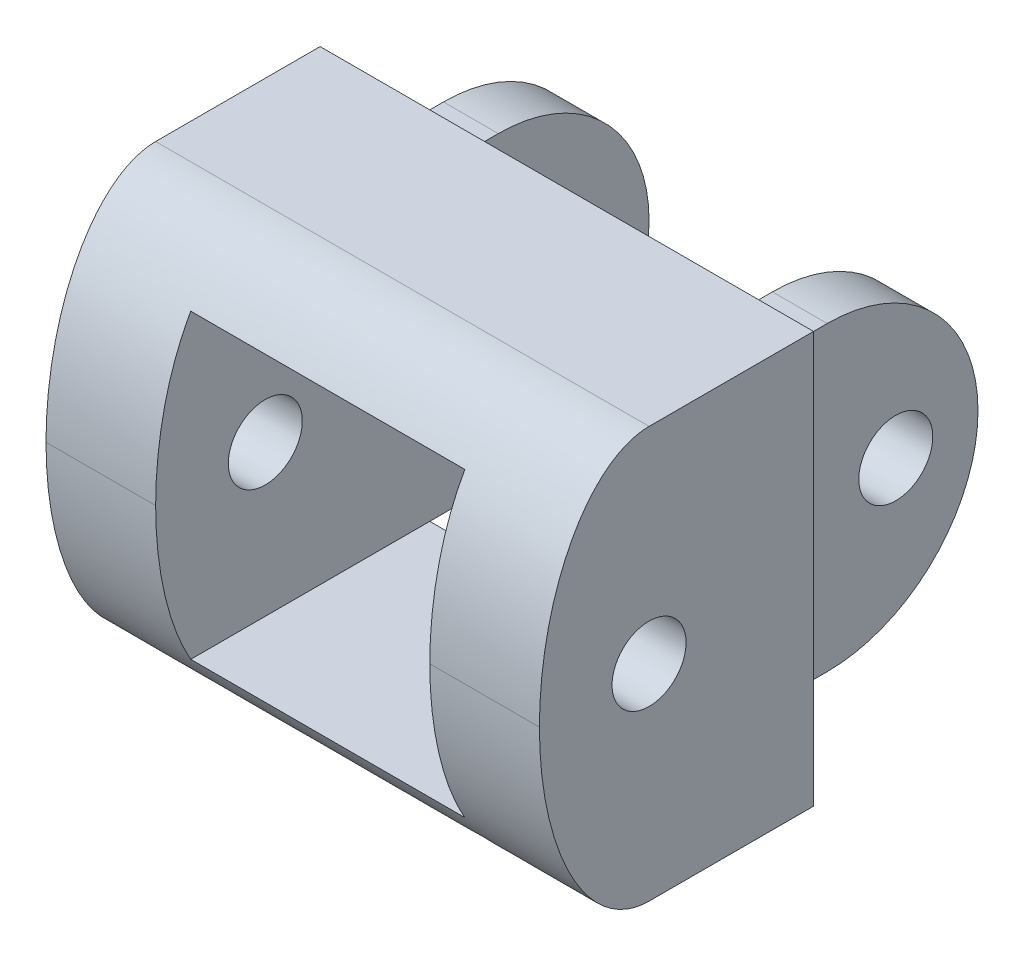
ISO-10303-21;
HEADER;
FILE_DESCRIPTION(('STEP AP214'),'2;1');
FILE_NAME('part.step','',(''),(''),'','','');
FILE_SCHEMA(('AUTOMOTIVE_DESIGN { 1 0 10303 214 1 1 1 1 }'));
ENDSEC;
DATA;
#1=APPLICATION_CONTEXT('core data for automotive mechanical design processes');
#2=APPLICATION_PROTOCOL_DEFINITION('international standard','automotive_design',2000,#1);
#3=PRODUCT_CONTEXT('',#1,'mechanical');
#4=PRODUCT('Part','Part','',(#3));
#5=PRODUCT_RELATED_PRODUCT_CATEGORY('part','',(#4));
#6=PRODUCT_DEFINITION_FORMATION('','',#4);
#7=PRODUCT_DEFINITION_CONTEXT('part definition',#1,'design');
#8=PRODUCT_DEFINITION('design','',#6,#7);
#9=PRODUCT_DEFINITION_SHAPE('','',#8);
#10=(LENGTH_UNIT() NAMED_UNIT(*) SI_UNIT(.MILLI.,.METRE.));
#11=(NAMED_UNIT(*) PLANE_ANGLE_UNIT() SI_UNIT($,.RADIAN.));
#12=(NAMED_UNIT(*) SI_UNIT($,.STERADIAN.) SOLID_ANGLE_UNIT());
#13=UNCERTAINTY_MEASURE_WITH_UNIT(LENGTH_MEASURE(1.E-05),#10,'distance_accuracy_value','');
#14=(GEOMETRIC_REPRESENTATION_CONTEXT(3) GLOBAL_UNCERTAINTY_ASSIGNED_CONTEXT((#13)) GLOBAL_UNIT_ASSIGNED_CONTEXT((#10,
#11,#12)) REPRESENTATION_CONTEXT('',''));
#15=CARTESIAN_POINT('',(0.,0.,0.));
#16=DIRECTION('',(0.,0.,1.));
#17=DIRECTION('',(1.,0.,0.));
#18=AXIS2_PLACEMENT_3D('',#15,#16,#17);
#19=CARTESIAN_POINT('',(16.,2.,-18.));
#20=DIRECTION('',(0.,1.,0.));
#21=DIRECTION('',(0.,0.,1.));
#22=AXIS2_PLACEMENT_3D('',#19,#20,#21);
#23=PLANE('',#22);
#24=DIRECTION('',(0.,0.,1.));
#25=VECTOR('',#24,1.);
#26=CARTESIAN_POINT('',(14.,2.,-10.));
#27=LINE('',#26,#25);
#28=CARTESIAN_POINT('',(14.,2.,-12.5));
#29=VERTEX_POINT('',#28);
#30=CARTESIAN_POINT('',(14.,2.,-10.));
#31=VERTEX_POINT('',#30);
#32=EDGE_CURVE('E226',#29,#31,#27,.T.);
#33=ORIENTED_EDGE('',*,*,#32,.F.);
#34=DIRECTION('',(-1.,0.,0.));
#35=VECTOR('',#34,1.);
#36=CARTESIAN_POINT('',(16.,2.,-12.5));
#37=LINE('',#36,#35);
#38=CARTESIAN_POINT('',(16.,2.,-12.5));
#39=VERTEX_POINT('',#38);
#40=EDGE_CURVE('E402',#29,#39,#37,.F.);
#41=ORIENTED_EDGE('',*,*,#40,.T.);
#42=DIRECTION('',(0.,0.,1.));
#43=VECTOR('',#42,1.);
#44=CARTESIAN_POINT('',(16.,2.,-18.));
#45=LINE('',#44,#43);
#46=CARTESIAN_POINT('',(16.,2.,-10.));
#47=VERTEX_POINT('',#46);
#48=EDGE_CURVE('E603',#39,#47,#45,.T.);
#49=ORIENTED_EDGE('',*,*,#48,.T.);
#50=DIRECTION('',(-1.,0.,0.));
#51=VECTOR('',#50,1.);
#52=CARTESIAN_POINT('',(16.,2.,-10.));
#53=LINE('',#52,#51);
#54=EDGE_CURVE('E405',#47,#31,#53,.T.);
#55=ORIENTED_EDGE('',*,*,#54,.T.);
#56=EDGE_LOOP('',(#33,#41,#49,#55));
#57=FACE_BOUND('',#56,.T.);
#58=ADVANCED_FACE('F37',(#57),#23,.F.);
#59=CARTESIAN_POINT('',(16.,13.,-18.));
#60=DIRECTION('',(0.,-1.,0.));
#61=DIRECTION('',(0.,0.,-1.));
#62=AXIS2_PLACEMENT_3D('',#59,#60,#61);
#63=PLANE('',#62);
#64=DIRECTION('',(0.,0.,1.));
#65=VECTOR('',#64,1.);
#66=CARTESIAN_POINT('',(4.,13.,-10.));
#67=LINE('',#66,#65);
#68=CARTESIAN_POINT('',(4.,13.,-12.5));
#69=VERTEX_POINT('',#68);
#70=CARTESIAN_POINT('',(4.,13.,-10.));
#71=VERTEX_POINT('',#70);
#72=EDGE_CURVE('E188',#69,#71,#67,.T.);
#73=ORIENTED_EDGE('',*,*,#72,.F.);
#74=DIRECTION('',(1.,0.,0.));
#75=VECTOR('',#74,1.);
#76=CARTESIAN_POINT('',(2.,13.,-12.5));
#77=LINE('',#76,#75);
#78=CARTESIAN_POINT('',(2.,13.,-12.5));
#79=VERTEX_POINT('',#78);
#80=EDGE_CURVE('E187',#69,#79,#77,.F.);
#81=ORIENTED_EDGE('',*,*,#80,.T.);
#82=DIRECTION('',(0.,0.,1.));
#83=VECTOR('',#82,1.);
#84=CARTESIAN_POINT('',(2.,13.,-18.));
#85=LINE('',#84,#83);
#86=CARTESIAN_POINT('',(2.,13.,-10.));
#87=VERTEX_POINT('',#86);
#88=EDGE_CURVE('E599',#79,#87,#85,.T.);
#89=ORIENTED_EDGE('',*,*,#88,.T.);
#90=DIRECTION('',(1.,0.,0.));
#91=VECTOR('',#90,1.);
#92=CARTESIAN_POINT('',(16.,13.,-10.));
#93=LINE('',#92,#91);
#94=EDGE_CURVE('E593',#87,#71,#93,.T.);
#95=ORIENTED_EDGE('',*,*,#94,.T.);
#96=EDGE_LOOP('',(#73,#81,#89,#95));
#97=FACE_BOUND('',#96,.T.);
#98=ADVANCED_FACE('F385',(#97),#63,.F.);
#99=CARTESIAN_POINT('',(0.,7.5,-12.5));
#100=DIRECTION('',(-1.,0.,0.));
#101=DIRECTION('',(0.,0.,1.));
#102=AXIS2_PLACEMENT_3D('',#99,#100,#101);
#103=CYLINDRICAL_SURFACE('',#102,5.5);
#104=DIRECTION('',(1.,0.,0.));
#105=VECTOR('',#104,1.);
#106=CARTESIAN_POINT('',(16.,7.5,-18.));
#107=LINE('',#106,#105);
#108=CARTESIAN_POINT('',(14.,7.5,-18.));
#109=VERTEX_POINT('',#108);
#110=CARTESIAN_POINT('',(16.,7.5,-18.));
#111=VERTEX_POINT('',#110);
#112=EDGE_CURVE('E193',#109,#111,#107,.T.);
#113=ORIENTED_EDGE('',*,*,#112,.F.);
#114=CARTESIAN_POINT('',(14.,7.5,-12.5));
#115=DIRECTION('',(-1.,0.,0.));
#116=DIRECTION('',(0.,0.,1.));
#117=AXIS2_PLACEMENT_3D('',#114,#115,#116);
#118=CIRCLE('',#117,5.5);
#119=CARTESIAN_POINT('',(14.,13.,-12.5));
#120=VERTEX_POINT('',#119);
#121=EDGE_CURVE('E178',#109,#120,#118,.F.);
#122=ORIENTED_EDGE('',*,*,#121,.T.);
#123=CARTESIAN_POINT('',(16.,13.,-12.5));
#124=VERTEX_POINT('',#123);
#125=EDGE_CURVE('E201',#124,#120,#77,.F.);
#126=ORIENTED_EDGE('',*,*,#125,.F.);
#127=CARTESIAN_POINT('',(16.,7.5,-12.5));
#128=DIRECTION('',(-1.,0.,0.));
#129=DIRECTION('',(0.,0.,1.));
#130=AXIS2_PLACEMENT_3D('',#127,#128,#129);
#131=CIRCLE('',#130,5.5);
#132=EDGE_CURVE('E416',#111,#124,#131,.F.);
#133=ORIENTED_EDGE('',*,*,#132,.F.);
#134=EDGE_LOOP('',(#113,#122,#126,#133));
#135=FACE_BOUND('',#134,.T.);
#136=ADVANCED_FACE('F392',(#135),#103,.T.);
#137=ORIENTED_EDGE('',*,*,#80,.F.);
#138=CARTESIAN_POINT('',(4.,7.5,-12.5));
#139=DIRECTION('',(1.,0.,0.));
#140=DIRECTION('',(0.,1.,0.));
#141=AXIS2_PLACEMENT_3D('',#138,#139,#140);
#142=CIRCLE('',#141,5.5);
#143=CARTESIAN_POINT('',(4.,7.5,-18.));
#144=VERTEX_POINT('',#143);
#145=EDGE_CURVE('E169',#69,#144,#142,.F.);
#146=ORIENTED_EDGE('',*,*,#145,.T.);
#147=CARTESIAN_POINT('',(2.,7.5,-18.));
#148=VERTEX_POINT('',#147);
#149=EDGE_CURVE('E185',#148,#144,#107,.T.);
#150=ORIENTED_EDGE('',*,*,#149,.F.);
#151=CARTESIAN_POINT('',(2.,7.5,-12.5));
#152=DIRECTION('',(1.,0.,0.));
#153=DIRECTION('',(0.,1.,0.));
#154=AXIS2_PLACEMENT_3D('',#151,#152,#153);
#155=CIRCLE('',#154,5.5);
#156=EDGE_CURVE('E285',#79,#148,#155,.F.);
#157=ORIENTED_EDGE('',*,*,#156,.F.);
#158=EDGE_LOOP('',(#137,#146,#150,#157));
#159=FACE_BOUND('',#158,.T.);
#160=ADVANCED_FACE('F183',(#159),#103,.T.);
#161=CARTESIAN_POINT('',(0.,7.5,-12.5));
#162=DIRECTION('',(1.,0.,0.));
#163=DIRECTION('',(0.,0.,-1.));
#164=AXIS2_PLACEMENT_3D('',#161,#162,#163);
#165=CYLINDRICAL_SURFACE('',#164,5.5);
#166=ORIENTED_EDGE('',*,*,#40,.F.);
#167=CARTESIAN_POINT('',(14.,7.5,-12.5));
#168=DIRECTION('',(-1.,0.,0.));
#169=DIRECTION('',(0.,0.,1.));
#170=AXIS2_PLACEMENT_3D('',#167,#168,#169);
#171=CIRCLE('',#170,5.5);
#172=EDGE_CURVE('E198',#29,#109,#171,.F.);
#173=ORIENTED_EDGE('',*,*,#172,.T.);
#174=ORIENTED_EDGE('',*,*,#112,.T.);
#175=CARTESIAN_POINT('',(16.,7.5,-12.5));
#176=DIRECTION('',(-1.,0.,0.));
#177=DIRECTION('',(0.,0.,1.));
#178=AXIS2_PLACEMENT_3D('',#175,#176,#177);
#179=CIRCLE('',#178,5.5);
#180=EDGE_CURVE('E412',#39,#111,#179,.F.);
#181=ORIENTED_EDGE('',*,*,#180,.F.);
#182=EDGE_LOOP('',(#166,#173,#174,#181));
#183=FACE_BOUND('',#182,.T.);
#184=ADVANCED_FACE('F325',(#183),#165,.T.);
#185=ORIENTED_EDGE('',*,*,#149,.T.);
#186=CARTESIAN_POINT('',(4.,7.5,-12.5));
#187=DIRECTION('',(1.,0.,0.));
#188=DIRECTION('',(0.,1.,0.));
#189=AXIS2_PLACEMENT_3D('',#186,#187,#188);
#190=CIRCLE('',#189,5.5);
#191=CARTESIAN_POINT('',(4.,2.,-12.5));
#192=VERTEX_POINT('',#191);
#193=EDGE_CURVE('E165',#144,#192,#190,.F.);
#194=ORIENTED_EDGE('',*,*,#193,.T.);
#195=CARTESIAN_POINT('',(2.,2.,-12.5));
#196=VERTEX_POINT('',#195);
#197=EDGE_CURVE('E414',#196,#192,#37,.F.);
#198=ORIENTED_EDGE('',*,*,#197,.F.);
#199=CARTESIAN_POINT('',(2.,7.5,-12.5));
#200=DIRECTION('',(1.,0.,0.));
#201=DIRECTION('',(0.,1.,0.));
#202=AXIS2_PLACEMENT_3D('',#199,#200,#201);
#203=CIRCLE('',#202,5.5);
#204=EDGE_CURVE('E191',#148,#196,#203,.F.);
#205=ORIENTED_EDGE('',*,*,#204,.F.);
#206=EDGE_LOOP('',(#185,#194,#198,#205));
#207=FACE_BOUND('',#206,.T.);
#208=ADVANCED_FACE('F190',(#207),#165,.T.);
#209=CARTESIAN_POINT('',(0.,0.,-10.));
#210=DIRECTION('',(0.,0.,-1.));
#211=DIRECTION('',(-1.,0.,0.));
#212=AXIS2_PLACEMENT_3D('',#209,#210,#211);
#213=PLANE('',#212);
#214=DIRECTION('',(0.,-1.,0.));
#215=VECTOR('',#214,1.);
#216=CARTESIAN_POINT('',(0.,0.,-10.));
#217=LINE('',#216,#215);
#218=CARTESIAN_POINT('',(0.,15.,-10.));
#219=VERTEX_POINT('',#218);
#220=CARTESIAN_POINT('',(0.,0.,-10.));
#221=VERTEX_POINT('',#220);
#222=EDGE_CURVE('E605',#219,#221,#217,.T.);
#223=ORIENTED_EDGE('',*,*,#222,.F.);
#224=DIRECTION('',(-1.,0.,0.));
#225=VECTOR('',#224,1.);
#226=CARTESIAN_POINT('',(0.,15.,-10.));
#227=LINE('',#226,#225);
#228=CARTESIAN_POINT('',(18.,15.,-10.));
#229=VERTEX_POINT('',#228);
#230=EDGE_CURVE('E290',#229,#219,#227,.T.);
#231=ORIENTED_EDGE('',*,*,#230,.F.);
#232=DIRECTION('',(0.,1.,0.));
#233=VECTOR('',#232,1.);
#234=CARTESIAN_POINT('',(18.,0.,-10.));
#235=LINE('',#234,#233);
#236=CARTESIAN_POINT('',(18.,0.,-10.));
#237=VERTEX_POINT('',#236);
#238=EDGE_CURVE('E609',#237,#229,#235,.T.);
#239=ORIENTED_EDGE('',*,*,#238,.F.);
#240=DIRECTION('',(1.,0.,0.));
#241=VECTOR('',#240,1.);
#242=CARTESIAN_POINT('',(0.,0.,-10.));
#243=LINE('',#242,#241);
#244=EDGE_CURVE('E446',#221,#237,#243,.T.);
#245=ORIENTED_EDGE('',*,*,#244,.F.);
#246=EDGE_LOOP('',(#223,#231,#239,#245));
#247=FACE_BOUND('',#246,.T.);
#248=ORIENTED_EDGE('',*,*,#54,.F.);
#249=DIRECTION('',(0.,-1.,0.));
#250=VECTOR('',#249,1.);
#251=CARTESIAN_POINT('',(16.,13.,-10.));
#252=LINE('',#251,#250);
#253=CARTESIAN_POINT('',(16.,13.,-10.));
#254=VERTEX_POINT('',#253);
#255=EDGE_CURVE('E192',#254,#47,#252,.T.);
#256=ORIENTED_EDGE('',*,*,#255,.F.);
#257=CARTESIAN_POINT('',(14.,13.,-10.));
#258=VERTEX_POINT('',#257);
#259=EDGE_CURVE('E590',#258,#254,#93,.T.);
#260=ORIENTED_EDGE('',*,*,#259,.F.);
#261=EDGE_CURVE('E591',#71,#258,#93,.T.);
#262=ORIENTED_EDGE('',*,*,#261,.F.);
#263=ORIENTED_EDGE('',*,*,#94,.F.);
#264=DIRECTION('',(0.,1.,0.));
#265=VECTOR('',#264,1.);
#266=CARTESIAN_POINT('',(2.,13.,-10.));
#267=LINE('',#266,#265);
#268=CARTESIAN_POINT('',(2.,2.,-10.));
#269=VERTEX_POINT('',#268);
#270=EDGE_CURVE('E588',#269,#87,#267,.T.);
#271=ORIENTED_EDGE('',*,*,#270,.F.);
#272=CARTESIAN_POINT('',(4.,2.,-10.));
#273=VERTEX_POINT('',#272);
#274=EDGE_CURVE('E196',#273,#269,#53,.T.);
#275=ORIENTED_EDGE('',*,*,#274,.F.);
#276=EDGE_CURVE('E579',#31,#273,#53,.T.);
#277=ORIENTED_EDGE('',*,*,#276,.F.);
#278=EDGE_LOOP('',(#248,#256,#260,#262,#263,#271,#275,#277));
#279=FACE_BOUND('',#278,.T.);
#280=ADVANCED_FACE('F323',(#247,#279),#213,.T.);
#281=CARTESIAN_POINT('',(0.,0.,-10.));
#282=DIRECTION('',(-1.,0.,0.));
#283=DIRECTION('',(0.,0.,1.));
#284=AXIS2_PLACEMENT_3D('',#281,#282,#283);
#285=PLANE('',#284);
#286=CARTESIAN_POINT('',(0.,7.5,-4.));
#287=DIRECTION('',(-1.,0.,0.));
#288=DIRECTION('',(0.,0.,1.));
#289=AXIS2_PLACEMENT_3D('',#286,#287,#288);
#290=CIRCLE('',#289,1.35);
#291=CARTESIAN_POINT('',(0.,7.5,-2.65));
#292=VERTEX_POINT('',#291);
#293=EDGE_CURVE('E535',#292,#292,#290,.T.);
#294=ORIENTED_EDGE('',*,*,#293,.F.);
#295=EDGE_LOOP('',(#294));
#296=FACE_BOUND('',#295,.T.);
#297=DIRECTION('',(0.,0.,1.));
#298=VECTOR('',#297,1.);
#299=CARTESIAN_POINT('',(0.,0.,-10.));
#300=LINE('',#299,#298);
#301=CARTESIAN_POINT('',(0.,0.,-4.));
#302=VERTEX_POINT('',#301);
#303=EDGE_CURVE('E276',#221,#302,#300,.T.);
#304=ORIENTED_EDGE('',*,*,#303,.T.);
#305=CARTESIAN_POINT('',(0.,7.5,0.));
#306=CARTESIAN_POINT('',(0.,0.,0.));
#307=CARTESIAN_POINT('',(0.,0.,-4.));
#308=(BOUNDED_CURVE() B_SPLINE_CURVE(2,(#305,#306,#307),.UNSPECIFIED.,.F.,
.F.) B_SPLINE_CURVE_WITH_KNOTS((3,3),(0.,1.),
.UNSPECIFIED.) CURVE() GEOMETRIC_REPRESENTATION_ITEM() RATIONAL_B_SPLINE_CURVE((1.,
0.707106781186548,1.)) REPRESENTATION_ITEM(''));
#309=CARTESIAN_POINT('',(0.,7.5,0.));
#310=VERTEX_POINT('',#309);
#311=EDGE_CURVE('E63',#302,#310,#308,.F.);
#312=ORIENTED_EDGE('',*,*,#311,.T.);
#313=CARTESIAN_POINT('',(0.,15.,-4.));
#314=CARTESIAN_POINT('',(0.,15.,0.));
#315=CARTESIAN_POINT('',(0.,7.5,0.));
#316=(BOUNDED_CURVE() B_SPLINE_CURVE(2,(#313,#314,#315),.UNSPECIFIED.,.F.,
.F.) B_SPLINE_CURVE_WITH_KNOTS((3,3),(0.,1.),
.UNSPECIFIED.) CURVE() GEOMETRIC_REPRESENTATION_ITEM() RATIONAL_B_SPLINE_CURVE((1.,
0.707106781186548,1.)) REPRESENTATION_ITEM(''));
#317=CARTESIAN_POINT('',(0.,15.,-4.));
#318=VERTEX_POINT('',#317);
#319=EDGE_CURVE('E57',#310,#318,#316,.F.);
#320=ORIENTED_EDGE('',*,*,#319,.T.);
#321=DIRECTION('',(0.,0.,1.));
#322=VECTOR('',#321,1.);
#323=CARTESIAN_POINT('',(0.,15.,-10.));
#324=LINE('',#323,#322);
#325=EDGE_CURVE('E304',#219,#318,#324,.T.);
#326=ORIENTED_EDGE('',*,*,#325,.F.);
#327=ORIENTED_EDGE('',*,*,#222,.T.);
#328=EDGE_LOOP('',(#304,#312,#320,#326,#327));
#329=FACE_BOUND('',#328,.T.);
#330=ADVANCED_FACE('F318',(#296,#329),#285,.T.);
#331=CARTESIAN_POINT('',(0.,15.,-10.));
#332=DIRECTION('',(0.,1.,0.));
#333=DIRECTION('',(0.,0.,1.));
#334=AXIS2_PLACEMENT_3D('',#331,#332,#333);
#335=PLANE('',#334);
#336=ORIENTED_EDGE('',*,*,#325,.T.);
#337=CARTESIAN_POINT('',(18.9,15.,-4.));
#338=CARTESIAN_POINT('',(12.3,15.,-4.));
#339=CARTESIAN_POINT('',(5.70000000000001,15.,-4.));
#340=CARTESIAN_POINT('',(-0.9,15.,-4.));
#341=(BOUNDED_CURVE() B_SPLINE_CURVE(3,(#337,#338,#339,#340),.UNSPECIFIED.,.F.,
.F.) B_SPLINE_CURVE_WITH_KNOTS((4,4),(-0.000900000000000001,0.0189),
.UNSPECIFIED.) CURVE() GEOMETRIC_REPRESENTATION_ITEM() RATIONAL_B_SPLINE_CURVE((1.,1.,1.,1.)) REPRESENTATION_ITEM(''));
#342=CARTESIAN_POINT('',(18.,15.,-4.));
#343=VERTEX_POINT('',#342);
#344=EDGE_CURVE('E12',#318,#343,#341,.F.);
#345=ORIENTED_EDGE('',*,*,#344,.T.);
#346=DIRECTION('',(0.,0.,1.));
#347=VECTOR('',#346,1.);
#348=CARTESIAN_POINT('',(18.,15.,-10.));
#349=LINE('',#348,#347);
#350=EDGE_CURVE('E275',#229,#343,#349,.T.);
#351=ORIENTED_EDGE('',*,*,#350,.F.);
#352=ORIENTED_EDGE('',*,*,#230,.T.);
#353=EDGE_LOOP('',(#336,#345,#351,#352));
#354=FACE_BOUND('',#353,.T.);
#355=ADVANCED_FACE('F322',(#354),#335,.T.);
#356=CARTESIAN_POINT('',(18.,0.,-10.));
#357=DIRECTION('',(1.,0.,0.));
#358=DIRECTION('',(0.,0.,-1.));
#359=AXIS2_PLACEMENT_3D('',#356,#357,#358);
#360=PLANE('',#359);
#361=CARTESIAN_POINT('',(18.,7.5,-4.));
#362=DIRECTION('',(1.,0.,0.));
#363=DIRECTION('',(0.,0.,-1.));
#364=AXIS2_PLACEMENT_3D('',#361,#362,#363);
#365=CIRCLE('',#364,1.35);
#366=CARTESIAN_POINT('',(18.,7.5,-5.35));
#367=VERTEX_POINT('',#366);
#368=EDGE_CURVE('E781',#367,#367,#365,.T.);
#369=ORIENTED_EDGE('',*,*,#368,.F.);
#370=EDGE_LOOP('',(#369));
#371=FACE_BOUND('',#370,.T.);
#372=CARTESIAN_POINT('',(18.,7.5,0.));
#373=CARTESIAN_POINT('',(18.,15.,0.));
#374=CARTESIAN_POINT('',(18.,15.,-4.));
#375=(BOUNDED_CURVE() B_SPLINE_CURVE(2,(#372,#373,#374),.UNSPECIFIED.,.F.,
.F.) B_SPLINE_CURVE_WITH_KNOTS((3,3),(0.,1.),
.UNSPECIFIED.) CURVE() GEOMETRIC_REPRESENTATION_ITEM() RATIONAL_B_SPLINE_CURVE((1.,
0.707106781186548,1.)) REPRESENTATION_ITEM(''));
#376=CARTESIAN_POINT('',(18.,7.49999999999999,0.));
#377=VERTEX_POINT('',#376);
#378=EDGE_CURVE('E433',#343,#377,#375,.F.);
#379=ORIENTED_EDGE('',*,*,#378,.T.);
#380=CARTESIAN_POINT('',(18.,0.,-4.));
#381=CARTESIAN_POINT('',(18.,0.,0.));
#382=CARTESIAN_POINT('',(18.,7.5,0.));
#383=(BOUNDED_CURVE() B_SPLINE_CURVE(2,(#380,#381,#382),.UNSPECIFIED.,.F.,
.F.) B_SPLINE_CURVE_WITH_KNOTS((3,3),(0.,1.),
.UNSPECIFIED.) CURVE() GEOMETRIC_REPRESENTATION_ITEM() RATIONAL_B_SPLINE_CURVE((1.,
0.707106781186548,1.)) REPRESENTATION_ITEM(''));
#384=CARTESIAN_POINT('',(18.,0.,-4.));
#385=VERTEX_POINT('',#384);
#386=EDGE_CURVE('E435',#377,#385,#383,.F.);
#387=ORIENTED_EDGE('',*,*,#386,.T.);
#388=DIRECTION('',(0.,0.,1.));
#389=VECTOR('',#388,1.);
#390=CARTESIAN_POINT('',(18.,0.,-10.));
#391=LINE('',#390,#389);
#392=EDGE_CURVE('E266',#237,#385,#391,.T.);
#393=ORIENTED_EDGE('',*,*,#392,.F.);
#394=ORIENTED_EDGE('',*,*,#238,.T.);
#395=ORIENTED_EDGE('',*,*,#350,.T.);
#396=EDGE_LOOP('',(#379,#387,#393,#394,#395));
#397=FACE_BOUND('',#396,.T.);
#398=ADVANCED_FACE('F315',(#371,#397),#360,.T.);
#399=CARTESIAN_POINT('',(0.,0.,-10.));
#400=DIRECTION('',(0.,-1.,0.));
#401=DIRECTION('',(0.,0.,-1.));
#402=AXIS2_PLACEMENT_3D('',#399,#400,#401);
#403=PLANE('',#402);
#404=ORIENTED_EDGE('',*,*,#392,.T.);
#405=CARTESIAN_POINT('',(-0.900000000000001,0.,-4.));
#406=CARTESIAN_POINT('',(5.69999999999999,0.,-4.));
#407=CARTESIAN_POINT('',(12.3,0.,-4.));
#408=CARTESIAN_POINT('',(18.9,0.,-4.));
#409=(BOUNDED_CURVE() B_SPLINE_CURVE(3,(#405,#406,#407,#408),.UNSPECIFIED.,.F.,
.F.) B_SPLINE_CURVE_WITH_KNOTS((4,4),(-0.0189,0.000900000000000001),
.UNSPECIFIED.) CURVE() GEOMETRIC_REPRESENTATION_ITEM() RATIONAL_B_SPLINE_CURVE((1.,1.,1.,1.)) REPRESENTATION_ITEM(''));
#410=EDGE_CURVE('E299',#385,#302,#409,.F.);
#411=ORIENTED_EDGE('',*,*,#410,.T.);
#412=ORIENTED_EDGE('',*,*,#303,.F.);
#413=ORIENTED_EDGE('',*,*,#244,.T.);
#414=EDGE_LOOP('',(#404,#411,#412,#413));
#415=FACE_BOUND('',#414,.T.);
#416=ADVANCED_FACE('F305',(#415),#403,.T.);
#417=CARTESIAN_POINT('',(16.,13.,-18.));
#418=DIRECTION('',(-1.,0.,0.));
#419=DIRECTION('',(0.,0.,1.));
#420=AXIS2_PLACEMENT_3D('',#417,#418,#419);
#421=PLANE('',#420);
#422=CARTESIAN_POINT('',(16.,7.5,-15.));
#423=DIRECTION('',(1.,0.,0.));
#424=DIRECTION('',(0.,0.,-1.));
#425=AXIS2_PLACEMENT_3D('',#422,#423,#424);
#426=CIRCLE('',#425,1.35);
#427=CARTESIAN_POINT('',(16.,7.5,-16.35));
#428=VERTEX_POINT('',#427);
#429=EDGE_CURVE('E207',#428,#428,#426,.T.);
#430=ORIENTED_EDGE('',*,*,#429,.F.);
#431=EDGE_LOOP('',(#430));
#432=FACE_BOUND('',#431,.T.);
#433=ORIENTED_EDGE('',*,*,#48,.F.);
#434=ORIENTED_EDGE('',*,*,#180,.T.);
#435=ORIENTED_EDGE('',*,*,#132,.T.);
#436=DIRECTION('',(0.,0.,1.));
#437=VECTOR('',#436,1.);
#438=CARTESIAN_POINT('',(16.,13.,-18.));
#439=LINE('',#438,#437);
#440=EDGE_CURVE('E596',#124,#254,#439,.T.);
#441=ORIENTED_EDGE('',*,*,#440,.T.);
#442=ORIENTED_EDGE('',*,*,#255,.T.);
#443=EDGE_LOOP('',(#433,#434,#435,#441,#442));
#444=FACE_BOUND('',#443,.T.);
#445=ADVANCED_FACE('F314',(#432,#444),#421,.F.);
#446=ORIENTED_EDGE('',*,*,#197,.T.);
#447=DIRECTION('',(0.,0.,1.));
#448=VECTOR('',#447,1.);
#449=CARTESIAN_POINT('',(4.,2.,-10.));
#450=LINE('',#449,#448);
#451=EDGE_CURVE('E173',#192,#273,#450,.T.);
#452=ORIENTED_EDGE('',*,*,#451,.T.);
#453=ORIENTED_EDGE('',*,*,#274,.T.);
#454=DIRECTION('',(0.,0.,1.));
#455=VECTOR('',#454,1.);
#456=CARTESIAN_POINT('',(2.,2.,-18.));
#457=LINE('',#456,#455);
#458=EDGE_CURVE('E601',#196,#269,#457,.T.);
#459=ORIENTED_EDGE('',*,*,#458,.F.);
#460=EDGE_LOOP('',(#446,#452,#453,#459));
#461=FACE_BOUND('',#460,.T.);
#462=ADVANCED_FACE('F374',(#461),#23,.F.);
#463=CARTESIAN_POINT('',(2.,13.,-18.));
#464=DIRECTION('',(1.,0.,0.));
#465=DIRECTION('',(0.,1.,0.));
#466=AXIS2_PLACEMENT_3D('',#463,#464,#465);
#467=PLANE('',#466);
#468=CARTESIAN_POINT('',(2.,7.5,-15.));
#469=DIRECTION('',(1.,0.,0.));
#470=DIRECTION('',(0.,1.,0.));
#471=AXIS2_PLACEMENT_3D('',#468,#469,#470);
#472=CIRCLE('',#471,1.35);
#473=CARTESIAN_POINT('',(2.,8.85,-15.));
#474=VERTEX_POINT('',#473);
#475=EDGE_CURVE('E212',#474,#474,#472,.T.);
#476=ORIENTED_EDGE('',*,*,#475,.T.);
#477=EDGE_LOOP('',(#476));
#478=FACE_BOUND('',#477,.T.);
#479=ORIENTED_EDGE('',*,*,#156,.T.);
#480=ORIENTED_EDGE('',*,*,#204,.T.);
#481=ORIENTED_EDGE('',*,*,#458,.T.);
#482=ORIENTED_EDGE('',*,*,#270,.T.);
#483=ORIENTED_EDGE('',*,*,#88,.F.);
#484=EDGE_LOOP('',(#479,#480,#481,#482,#483));
#485=FACE_BOUND('',#484,.T.);
#486=ADVANCED_FACE('F378',(#478,#485),#467,.F.);
#487=ORIENTED_EDGE('',*,*,#125,.T.);
#488=DIRECTION('',(0.,0.,1.));
#489=VECTOR('',#488,1.);
#490=CARTESIAN_POINT('',(14.,13.,-10.));
#491=LINE('',#490,#489);
#492=EDGE_CURVE('E221',#120,#258,#491,.T.);
#493=ORIENTED_EDGE('',*,*,#492,.T.);
#494=ORIENTED_EDGE('',*,*,#259,.T.);
#495=ORIENTED_EDGE('',*,*,#440,.F.);
#496=EDGE_LOOP('',(#487,#493,#494,#495));
#497=FACE_BOUND('',#496,.T.);
#498=ADVANCED_FACE('F381',(#497),#63,.F.);
#499=CARTESIAN_POINT('',(4.,0.,-10.));
#500=DIRECTION('',(-1.,0.,0.));
#501=DIRECTION('',(0.,0.,1.));
#502=AXIS2_PLACEMENT_3D('',#499,#500,#501);
#503=PLANE('',#502);
#504=CARTESIAN_POINT('',(4.,7.5,-4.));
#505=DIRECTION('',(-1.,0.,0.));
#506=DIRECTION('',(0.,0.,1.));
#507=AXIS2_PLACEMENT_3D('',#504,#505,#506);
#508=CIRCLE('',#507,1.35);
#509=CARTESIAN_POINT('',(4.,7.5,-2.65));
#510=VERTEX_POINT('',#509);
#511=EDGE_CURVE('E537',#510,#510,#508,.T.);
#512=ORIENTED_EDGE('',*,*,#511,.T.);
#513=EDGE_LOOP('',(#512));
#514=FACE_BOUND('',#513,.T.);
#515=CARTESIAN_POINT('',(4.,7.5,-15.));
#516=DIRECTION('',(-1.,0.,0.));
#517=DIRECTION('',(0.,0.,1.));
#518=AXIS2_PLACEMENT_3D('',#515,#516,#517);
#519=CIRCLE('',#518,1.35);
#520=CARTESIAN_POINT('',(4.,7.5,-13.65));
#521=VERTEX_POINT('',#520);
#522=EDGE_CURVE('E206',#521,#521,#519,.T.);
#523=ORIENTED_EDGE('',*,*,#522,.T.);
#524=EDGE_LOOP('',(#523));
#525=FACE_BOUND('',#524,.T.);
#526=CARTESIAN_POINT('',(4.,7.5,0.));
#527=CARTESIAN_POINT('',(4.,15.,0.));
#528=CARTESIAN_POINT('',(4.,15.,-4.));
#529=(BOUNDED_CURVE() B_SPLINE_CURVE(2,(#526,#527,#528),.UNSPECIFIED.,.F.,
.F.) B_SPLINE_CURVE_WITH_KNOTS((3,3),(0.,1.),
.UNSPECIFIED.) CURVE() GEOMETRIC_REPRESENTATION_ITEM() RATIONAL_B_SPLINE_CURVE((1.,
0.707106781186548,1.)) REPRESENTATION_ITEM(''));
#530=CARTESIAN_POINT('',(4.,13.,-1.28052292608385));
#531=VERTEX_POINT('',#530);
#532=CARTESIAN_POINT('',(4.,7.5,0.));
#533=VERTEX_POINT('',#532);
#534=EDGE_CURVE('E421',#531,#533,#529,.F.);
#535=ORIENTED_EDGE('',*,*,#534,.T.);
#536=CARTESIAN_POINT('',(4.,0.,-4.));
#537=CARTESIAN_POINT('',(4.,0.,0.));
#538=CARTESIAN_POINT('',(4.,7.5,0.));
#539=(BOUNDED_CURVE() B_SPLINE_CURVE(2,(#536,#537,#538),.UNSPECIFIED.,.F.,
.F.) B_SPLINE_CURVE_WITH_KNOTS((3,3),(0.,1.),
.UNSPECIFIED.) CURVE() GEOMETRIC_REPRESENTATION_ITEM() RATIONAL_B_SPLINE_CURVE((1.,
0.707106781186548,1.)) REPRESENTATION_ITEM(''));
#540=CARTESIAN_POINT('',(4.,2.,-1.28052292608385));
#541=VERTEX_POINT('',#540);
#542=EDGE_CURVE('E424',#533,#541,#539,.F.);
#543=ORIENTED_EDGE('',*,*,#542,.T.);
#544=EDGE_CURVE('E208',#273,#541,#450,.T.);
#545=ORIENTED_EDGE('',*,*,#544,.F.);
#546=ORIENTED_EDGE('',*,*,#451,.F.);
#547=ORIENTED_EDGE('',*,*,#193,.F.);
#548=ORIENTED_EDGE('',*,*,#145,.F.);
#549=ORIENTED_EDGE('',*,*,#72,.T.);
#550=EDGE_CURVE('E213',#71,#531,#67,.T.);
#551=ORIENTED_EDGE('',*,*,#550,.T.);
#552=EDGE_LOOP('',(#535,#543,#545,#546,#547,#548,#549,#551));
#553=FACE_BOUND('',#552,.T.);
#554=ADVANCED_FACE('F167',(#514,#525,#553),#503,.F.);
#555=CARTESIAN_POINT('',(0.,13.,-10.));
#556=DIRECTION('',(0.,1.,0.));
#557=DIRECTION('',(0.,0.,1.));
#558=AXIS2_PLACEMENT_3D('',#555,#556,#557);
#559=PLANE('',#558);
#560=CARTESIAN_POINT('',(14.,13.,-1.28052292608385));
#561=VERTEX_POINT('',#560);
#562=EDGE_CURVE('E225',#258,#561,#491,.T.);
#563=ORIENTED_EDGE('',*,*,#562,.T.);
#564=CARTESIAN_POINT('',(-0.9,13.,-1.28052292608385));
#565=CARTESIAN_POINT('',(5.7,13.,-1.28052292608385));
#566=CARTESIAN_POINT('',(12.3,13.,-1.28052292608385));
#567=CARTESIAN_POINT('',(18.9,13.,-1.28052292608385));
#568=(BOUNDED_CURVE() B_SPLINE_CURVE(3,(#564,#565,#566,#567),.UNSPECIFIED.,.F.,
.F.) B_SPLINE_CURVE_WITH_KNOTS((4,4),(-0.0009,0.0189),
.UNSPECIFIED.) CURVE() GEOMETRIC_REPRESENTATION_ITEM() RATIONAL_B_SPLINE_CURVE((0.853858584015202,
0.853858584015202,0.853858584015202,0.853858584015202)) REPRESENTATION_ITEM(''));
#569=EDGE_CURVE('E50',#561,#531,#568,.F.);
#570=ORIENTED_EDGE('',*,*,#569,.T.);
#571=ORIENTED_EDGE('',*,*,#550,.F.);
#572=ORIENTED_EDGE('',*,*,#261,.T.);
#573=EDGE_LOOP('',(#563,#570,#571,#572));
#574=FACE_BOUND('',#573,.T.);
#575=ADVANCED_FACE('F256',(#574),#559,.F.);
#576=CARTESIAN_POINT('',(14.,0.,-10.));
#577=DIRECTION('',(1.,0.,0.));
#578=DIRECTION('',(0.,0.,-1.));
#579=AXIS2_PLACEMENT_3D('',#576,#577,#578);
#580=PLANE('',#579);
#581=CARTESIAN_POINT('',(14.,7.5,-4.));
#582=DIRECTION('',(1.,0.,0.));
#583=DIRECTION('',(0.,0.,-1.));
#584=AXIS2_PLACEMENT_3D('',#581,#582,#583);
#585=CIRCLE('',#584,1.35);
#586=CARTESIAN_POINT('',(14.,7.5,-5.35));
#587=VERTEX_POINT('',#586);
#588=EDGE_CURVE('E45',#587,#587,#585,.T.);
#589=ORIENTED_EDGE('',*,*,#588,.T.);
#590=EDGE_LOOP('',(#589));
#591=FACE_BOUND('',#590,.T.);
#592=CARTESIAN_POINT('',(14.,7.5,-15.));
#593=DIRECTION('',(1.,0.,0.));
#594=DIRECTION('',(0.,0.,-1.));
#595=AXIS2_PLACEMENT_3D('',#592,#593,#594);
#596=CIRCLE('',#595,1.35);
#597=CARTESIAN_POINT('',(14.,7.5,-16.35));
#598=VERTEX_POINT('',#597);
#599=EDGE_CURVE('E203',#598,#598,#596,.T.);
#600=ORIENTED_EDGE('',*,*,#599,.T.);
#601=EDGE_LOOP('',(#600));
#602=FACE_BOUND('',#601,.T.);
#603=CARTESIAN_POINT('',(14.,2.,-1.28052292608385));
#604=VERTEX_POINT('',#603);
#605=EDGE_CURVE('E218',#31,#604,#27,.T.);
#606=ORIENTED_EDGE('',*,*,#605,.T.);
#607=CARTESIAN_POINT('',(14.,7.5,0.));
#608=CARTESIAN_POINT('',(14.,0.,0.));
#609=CARTESIAN_POINT('',(14.,0.,-4.));
#610=(BOUNDED_CURVE() B_SPLINE_CURVE(2,(#607,#608,#609),.UNSPECIFIED.,.F.,
.F.) B_SPLINE_CURVE_WITH_KNOTS((3,3),(0.,1.),
.UNSPECIFIED.) CURVE() GEOMETRIC_REPRESENTATION_ITEM() RATIONAL_B_SPLINE_CURVE((1.,
0.707106781186548,1.)) REPRESENTATION_ITEM(''));
#611=CARTESIAN_POINT('',(14.,7.5,0.));
#612=VERTEX_POINT('',#611);
#613=EDGE_CURVE('E432',#604,#612,#610,.F.);
#614=ORIENTED_EDGE('',*,*,#613,.T.);
#615=CARTESIAN_POINT('',(14.,15.,-4.));
#616=CARTESIAN_POINT('',(14.,15.,0.));
#617=CARTESIAN_POINT('',(14.,7.5,0.));
#618=(BOUNDED_CURVE() B_SPLINE_CURVE(2,(#615,#616,#617),.UNSPECIFIED.,.F.,
.F.) B_SPLINE_CURVE_WITH_KNOTS((3,3),(0.,1.),
.UNSPECIFIED.) CURVE() GEOMETRIC_REPRESENTATION_ITEM() RATIONAL_B_SPLINE_CURVE((1.,
0.707106781186548,1.)) REPRESENTATION_ITEM(''));
#619=EDGE_CURVE('E240',#612,#561,#618,.F.);
#620=ORIENTED_EDGE('',*,*,#619,.T.);
#621=ORIENTED_EDGE('',*,*,#562,.F.);
#622=ORIENTED_EDGE('',*,*,#492,.F.);
#623=ORIENTED_EDGE('',*,*,#121,.F.);
#624=ORIENTED_EDGE('',*,*,#172,.F.);
#625=ORIENTED_EDGE('',*,*,#32,.T.);
#626=EDGE_LOOP('',(#606,#614,#620,#621,#622,#623,#624,#625));
#627=FACE_BOUND('',#626,.T.);
#628=ADVANCED_FACE('F246',(#591,#602,#627),#580,.F.);
#629=CARTESIAN_POINT('',(0.,2.,-10.));
#630=DIRECTION('',(0.,-1.,0.));
#631=DIRECTION('',(0.,0.,-1.));
#632=AXIS2_PLACEMENT_3D('',#629,#630,#631);
#633=PLANE('',#632);
#634=ORIENTED_EDGE('',*,*,#544,.T.);
#635=CARTESIAN_POINT('',(18.9,2.,-1.28052292608385));
#636=CARTESIAN_POINT('',(12.3,2.,-1.28052292608385));
#637=CARTESIAN_POINT('',(5.69999999999999,2.,-1.28052292608385));
#638=CARTESIAN_POINT('',(-0.900000000000001,2.,-1.28052292608385));
#639=(BOUNDED_CURVE() B_SPLINE_CURVE(3,(#635,#636,#637,#638),.UNSPECIFIED.,.F.,
.F.) B_SPLINE_CURVE_WITH_KNOTS((4,4),(-0.0189,0.0009),
.UNSPECIFIED.) CURVE() GEOMETRIC_REPRESENTATION_ITEM() RATIONAL_B_SPLINE_CURVE((0.853858584015202,
0.853858584015202,0.853858584015202,0.853858584015202)) REPRESENTATION_ITEM(''));
#640=EDGE_CURVE('E428',#541,#604,#639,.F.);
#641=ORIENTED_EDGE('',*,*,#640,.T.);
#642=ORIENTED_EDGE('',*,*,#605,.F.);
#643=ORIENTED_EDGE('',*,*,#276,.T.);
#644=EDGE_LOOP('',(#634,#641,#642,#643));
#645=FACE_BOUND('',#644,.T.);
#646=ADVANCED_FACE('F255',(#645),#633,.F.);
#647=CARTESIAN_POINT('',(0.,7.5,-15.));
#648=DIRECTION('',(1.,0.,0.));
#649=DIRECTION('',(0.,0.,-1.));
#650=AXIS2_PLACEMENT_3D('',#647,#648,#649);
#651=CYLINDRICAL_SURFACE('',#650,1.35);
#652=ORIENTED_EDGE('',*,*,#429,.T.);
#653=EDGE_LOOP('',(#652));
#654=FACE_BOUND('',#653,.T.);
#655=ORIENTED_EDGE('',*,*,#599,.F.);
#656=EDGE_LOOP('',(#655));
#657=FACE_BOUND('',#656,.T.);
#658=ADVANCED_FACE('F554',(#654,#657),#651,.F.);
#659=ORIENTED_EDGE('',*,*,#522,.F.);
#660=EDGE_LOOP('',(#659));
#661=FACE_BOUND('',#660,.T.);
#662=ORIENTED_EDGE('',*,*,#475,.F.);
#663=EDGE_LOOP('',(#662));
#664=FACE_BOUND('',#663,.T.);
#665=ADVANCED_FACE('F552',(#661,#664),#651,.F.);
#666=CARTESIAN_POINT('',(-0.9,15.,-4.));
#667=CARTESIAN_POINT('',(5.70000000000001,15.,-4.));
#668=CARTESIAN_POINT('',(12.3,15.,-4.));
#669=CARTESIAN_POINT('',(18.9,15.,-4.));
#670=CARTESIAN_POINT('',(-0.9,15.,0.));
#671=CARTESIAN_POINT('',(5.7,15.,0.));
#672=CARTESIAN_POINT('',(12.3,15.,0.));
#673=CARTESIAN_POINT('',(18.9,15.,0.));
#674=CARTESIAN_POINT('',(-0.9,7.5,0.));
#675=CARTESIAN_POINT('',(5.70000000000001,7.5,0.));
#676=CARTESIAN_POINT('',(12.3,7.5,0.));
#677=CARTESIAN_POINT('',(18.9,7.5,0.));
#678=(BOUNDED_SURFACE() B_SPLINE_SURFACE(2,3,((#666,#667,#668,#669),(#670,#671,#672,#673),(#674,
#675,#676,#677)),.UNSPECIFIED.,.F.,.F.,.F.) B_SPLINE_SURFACE_WITH_KNOTS((3,3),(4,4),(0.,1.),
(-0.0009,0.0189),.UNSPECIFIED.) GEOMETRIC_REPRESENTATION_ITEM() RATIONAL_B_SPLINE_SURFACE(((1.,
1.,1.,1.),(0.707106781186548,0.707106781186548,0.707106781186548,0.707106781186548),(1.,1.,1.,1.))) REPRESENTATION_ITEM('') SURFACE());
#679=CARTESIAN_POINT('',(18.9,7.5,0.));
#680=CARTESIAN_POINT('',(12.3,7.5,0.));
#681=CARTESIAN_POINT('',(5.69999999999999,7.5,0.));
#682=CARTESIAN_POINT('',(-0.900000000000001,7.5,0.));
#683=(BOUNDED_CURVE() B_SPLINE_CURVE(3,(#679,#680,#681,#682),.UNSPECIFIED.,.F.,
.F.) B_SPLINE_CURVE_WITH_KNOTS((4,4),(-0.0189,0.0009),
.UNSPECIFIED.) CURVE() GEOMETRIC_REPRESENTATION_ITEM() RATIONAL_B_SPLINE_CURVE((1.,1.,1.,1.)) REPRESENTATION_ITEM(''));
#684=EDGE_CURVE('E515',#533,#310,#683,.T.);
#685=CARTESIAN_POINT('',(18.9,7.5,0.));
#686=CARTESIAN_POINT('',(12.3,7.5,0.));
#687=CARTESIAN_POINT('',(5.69999999999999,7.5,0.));
#688=CARTESIAN_POINT('',(-0.900000000000001,7.5,0.));
#689=(BOUNDED_CURVE() B_SPLINE_CURVE(3,(#685,#686,#687,#688),.UNSPECIFIED.,.F.,
.F.) B_SPLINE_CURVE_WITH_KNOTS((4,4),(-0.0189,0.0009),
.UNSPECIFIED.) CURVE() GEOMETRIC_REPRESENTATION_ITEM() RATIONAL_B_SPLINE_CURVE((1.,1.,1.,1.)) REPRESENTATION_ITEM(''));
#690=EDGE_CURVE('E525',#377,#612,#689,.T.);
#691=ORIENTED_EDGE('',*,*,#344,.F.);
#692=ORIENTED_EDGE('',*,*,#319,.F.);
#693=ORIENTED_EDGE('',*,*,#684,.F.);
#694=ORIENTED_EDGE('',*,*,#534,.F.);
#695=ORIENTED_EDGE('',*,*,#569,.F.);
#696=ORIENTED_EDGE('',*,*,#619,.F.);
#697=ORIENTED_EDGE('',*,*,#690,.F.);
#698=ORIENTED_EDGE('',*,*,#378,.F.);
#699=EDGE_LOOP('',(#691,#692,#693,#694,#695,#696,#697,#698));
#700=FACE_BOUND('',#699,.T.);
#701=ADVANCED_FACE('F40',(#700),#678,.T.);
#702=CARTESIAN_POINT('',(18.9,0.,-4.));
#703=CARTESIAN_POINT('',(12.3,0.,-4.));
#704=CARTESIAN_POINT('',(5.69999999999999,0.,-4.));
#705=CARTESIAN_POINT('',(-0.900000000000001,0.,-4.));
#706=CARTESIAN_POINT('',(18.9,0.,0.));
#707=CARTESIAN_POINT('',(12.3,0.,0.));
#708=CARTESIAN_POINT('',(5.69999999999999,0.,0.));
#709=CARTESIAN_POINT('',(-0.9,0.,0.));
#710=CARTESIAN_POINT('',(18.9,7.5,0.));
#711=CARTESIAN_POINT('',(12.3,7.5,0.));
#712=CARTESIAN_POINT('',(5.69999999999999,7.5,0.));
#713=CARTESIAN_POINT('',(-0.900000000000001,7.5,0.));
#714=(BOUNDED_SURFACE() B_SPLINE_SURFACE(2,3,((#702,#703,#704,#705),(#706,#707,#708,#709),(#710,
#711,#712,#713)),.UNSPECIFIED.,.F.,.F.,.F.) B_SPLINE_SURFACE_WITH_KNOTS((3,3),(4,4),(0.,1.),
(-0.0189,0.0009),.UNSPECIFIED.) GEOMETRIC_REPRESENTATION_ITEM() RATIONAL_B_SPLINE_SURFACE(((1.,
1.,1.,1.),(0.707106781186548,0.707106781186548,0.707106781186548,0.707106781186548),(1.,1.,1.,1.))) REPRESENTATION_ITEM('') SURFACE());
#715=ORIENTED_EDGE('',*,*,#311,.F.);
#716=ORIENTED_EDGE('',*,*,#410,.F.);
#717=ORIENTED_EDGE('',*,*,#386,.F.);
#718=ORIENTED_EDGE('',*,*,#690,.T.);
#719=ORIENTED_EDGE('',*,*,#613,.F.);
#720=ORIENTED_EDGE('',*,*,#640,.F.);
#721=ORIENTED_EDGE('',*,*,#542,.F.);
#722=ORIENTED_EDGE('',*,*,#684,.T.);
#723=EDGE_LOOP('',(#715,#716,#717,#718,#719,#720,#721,#722));
#724=FACE_BOUND('',#723,.T.);
#725=ADVANCED_FACE('F448',(#724),#714,.T.);
#726=CARTESIAN_POINT('',(-0.0199999999999992,7.5,-4.));
#727=DIRECTION('',(1.,0.,0.));
#728=DIRECTION('',(0.,0.,-1.));
#729=AXIS2_PLACEMENT_3D('',#726,#727,#728);
#730=CYLINDRICAL_SURFACE('',#729,1.35);
#731=ORIENTED_EDGE('',*,*,#368,.T.);
#732=EDGE_LOOP('',(#731));
#733=FACE_BOUND('',#732,.T.);
#734=ORIENTED_EDGE('',*,*,#588,.F.);
#735=EDGE_LOOP('',(#734));
#736=FACE_BOUND('',#735,.T.);
#737=ADVANCED_FACE('F471',(#733,#736),#730,.F.);
#738=ORIENTED_EDGE('',*,*,#293,.T.);
#739=EDGE_LOOP('',(#738));
#740=FACE_BOUND('',#739,.T.);
#741=ORIENTED_EDGE('',*,*,#511,.F.);
#742=EDGE_LOOP('',(#741));
#743=FACE_BOUND('',#742,.T.);
#744=ADVANCED_FACE('F564',(#740,#743),#730,.F.);
#745=CLOSED_SHELL('',(#58,#98,#136,#160,#184,#208,#280,#330,#355,#398,#416,#445,#462,#486,#498,
#554,#575,#628,#646,#658,#665,#701,#725,#737,#744));
#746=MANIFOLD_SOLID_BREP('B2',#745);
#747=ADVANCED_BREP_SHAPE_REPRESENTATION('',(#18,#746),#14);
#748=SHAPE_DEFINITION_REPRESENTATION(#9,#747);
ENDSEC;
END-ISO-10303-21;
